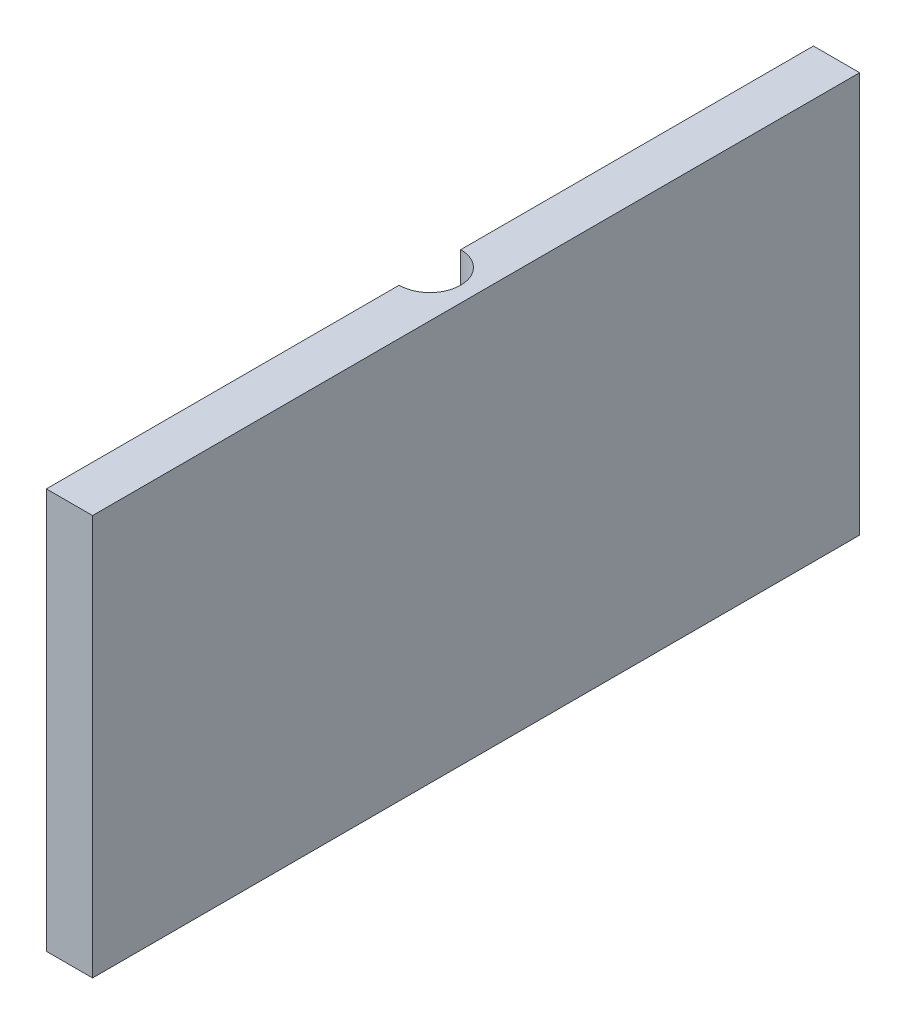
ISO-10303-21;
HEADER;
FILE_DESCRIPTION(('STEP AP214'),'2;1');
FILE_NAME('part.step','',(''),(''),'','','');
FILE_SCHEMA(('AUTOMOTIVE_DESIGN { 1 0 10303 214 1 1 1 1 }'));
ENDSEC;
DATA;
#1=APPLICATION_CONTEXT('core data for automotive mechanical design processes');
#2=APPLICATION_PROTOCOL_DEFINITION('international standard','automotive_design',2000,#1);
#3=PRODUCT_CONTEXT('',#1,'mechanical');
#4=PRODUCT('Part','Part','',(#3));
#5=PRODUCT_RELATED_PRODUCT_CATEGORY('part','',(#4));
#6=PRODUCT_DEFINITION_FORMATION('','',#4);
#7=PRODUCT_DEFINITION_CONTEXT('part definition',#1,'design');
#8=PRODUCT_DEFINITION('design','',#6,#7);
#9=PRODUCT_DEFINITION_SHAPE('','',#8);
#10=(LENGTH_UNIT() NAMED_UNIT(*) SI_UNIT(.MILLI.,.METRE.));
#11=(NAMED_UNIT(*) PLANE_ANGLE_UNIT() SI_UNIT($,.RADIAN.));
#12=(NAMED_UNIT(*) SI_UNIT($,.STERADIAN.) SOLID_ANGLE_UNIT());
#13=UNCERTAINTY_MEASURE_WITH_UNIT(LENGTH_MEASURE(1.E-05),#10,'distance_accuracy_value','');
#14=(GEOMETRIC_REPRESENTATION_CONTEXT(3) GLOBAL_UNCERTAINTY_ASSIGNED_CONTEXT((#13)) GLOBAL_UNIT_ASSIGNED_CONTEXT((#10,
#11,#12)) REPRESENTATION_CONTEXT('',''));
#15=CARTESIAN_POINT('',(0.,0.,0.));
#16=DIRECTION('',(0.,0.,1.));
#17=DIRECTION('',(1.,0.,0.));
#18=AXIS2_PLACEMENT_3D('',#15,#16,#17);
#19=CARTESIAN_POINT('',(7.5,130.,124.5));
#20=DIRECTION('',(-1.,0.,0.));
#21=DIRECTION('',(0.,0.,1.));
#22=AXIS2_PLACEMENT_3D('',#19,#20,#21);
#23=PLANE('',#22);
#24=DIRECTION('',(0.,0.,-1.));
#25=VECTOR('',#24,1.);
#26=CARTESIAN_POINT('',(7.5,0.,124.5));
#27=LINE('',#26,#25);
#28=CARTESIAN_POINT('',(7.5,0.,124.5));
#29=VERTEX_POINT('',#28);
#30=CARTESIAN_POINT('',(7.5,0.,-124.5));
#31=VERTEX_POINT('',#30);
#32=EDGE_CURVE('E118',#29,#31,#27,.T.);
#33=ORIENTED_EDGE('',*,*,#32,.T.);
#34=DIRECTION('',(0.,-1.,0.));
#35=VECTOR('',#34,1.);
#36=CARTESIAN_POINT('',(7.5,130.,-124.5));
#37=LINE('',#36,#35);
#38=CARTESIAN_POINT('',(7.5,130.,-124.5));
#39=VERTEX_POINT('',#38);
#40=EDGE_CURVE('E47',#39,#31,#37,.T.);
#41=ORIENTED_EDGE('',*,*,#40,.F.);
#42=DIRECTION('',(0.,0.,-1.));
#43=VECTOR('',#42,1.);
#44=CARTESIAN_POINT('',(7.5,130.,124.5));
#45=LINE('',#44,#43);
#46=CARTESIAN_POINT('',(7.5,130.,124.5));
#47=VERTEX_POINT('',#46);
#48=EDGE_CURVE('E122',#47,#39,#45,.T.);
#49=ORIENTED_EDGE('',*,*,#48,.F.);
#50=DIRECTION('',(0.,-1.,0.));
#51=VECTOR('',#50,1.);
#52=CARTESIAN_POINT('',(7.5,130.,124.5));
#53=LINE('',#52,#51);
#54=EDGE_CURVE('E133',#47,#29,#53,.T.);
#55=ORIENTED_EDGE('',*,*,#54,.T.);
#56=EDGE_LOOP('',(#33,#41,#49,#55));
#57=FACE_BOUND('',#56,.T.);
#58=ADVANCED_FACE('F39',(#57),#23,.F.);
#59=CARTESIAN_POINT('',(-7.5,130.,-124.5));
#60=DIRECTION('',(0.,0.,1.));
#61=DIRECTION('',(1.,0.,0.));
#62=AXIS2_PLACEMENT_3D('',#59,#60,#61);
#63=PLANE('',#62);
#64=DIRECTION('',(-1.,0.,0.));
#65=VECTOR('',#64,1.);
#66=CARTESIAN_POINT('',(-7.5,0.,-124.5));
#67=LINE('',#66,#65);
#68=CARTESIAN_POINT('',(-7.5,0.,-124.5));
#69=VERTEX_POINT('',#68);
#70=EDGE_CURVE('E137',#31,#69,#67,.T.);
#71=ORIENTED_EDGE('',*,*,#70,.T.);
#72=DIRECTION('',(0.,-1.,0.));
#73=VECTOR('',#72,1.);
#74=CARTESIAN_POINT('',(-7.5,130.,-124.5));
#75=LINE('',#74,#73);
#76=CARTESIAN_POINT('',(-7.5,130.,-124.5));
#77=VERTEX_POINT('',#76);
#78=EDGE_CURVE('E150',#77,#69,#75,.T.);
#79=ORIENTED_EDGE('',*,*,#78,.F.);
#80=DIRECTION('',(-1.,0.,0.));
#81=VECTOR('',#80,1.);
#82=CARTESIAN_POINT('',(-7.5,130.,-124.5));
#83=LINE('',#82,#81);
#84=EDGE_CURVE('E92',#39,#77,#83,.T.);
#85=ORIENTED_EDGE('',*,*,#84,.F.);
#86=ORIENTED_EDGE('',*,*,#40,.T.);
#87=EDGE_LOOP('',(#71,#79,#85,#86));
#88=FACE_BOUND('',#87,.T.);
#89=ADVANCED_FACE('F155',(#88),#63,.F.);
#90=CARTESIAN_POINT('',(-7.5,130.,124.5));
#91=DIRECTION('',(1.,0.,0.));
#92=DIRECTION('',(0.,0.,-1.));
#93=AXIS2_PLACEMENT_3D('',#90,#91,#92);
#94=PLANE('',#93);
#95=DIRECTION('',(0.,0.,1.));
#96=VECTOR('',#95,1.);
#97=CARTESIAN_POINT('',(-7.5,80.,124.5));
#98=LINE('',#97,#96);
#99=CARTESIAN_POINT('',(-7.5,80.,-9.99999999999969));
#100=VERTEX_POINT('',#99);
#101=CARTESIAN_POINT('',(-7.5,80.,10.0000000000003));
#102=VERTEX_POINT('',#101);
#103=EDGE_CURVE('E11',#100,#102,#98,.T.);
#104=ORIENTED_EDGE('',*,*,#103,.F.);
#105=DIRECTION('',(0.,1.,0.));
#106=VECTOR('',#105,1.);
#107=CARTESIAN_POINT('',(-7.5,80.,-9.99999999999969));
#108=LINE('',#107,#106);
#109=CARTESIAN_POINT('',(-7.5,130.,-9.99999999999969));
#110=VERTEX_POINT('',#109);
#111=EDGE_CURVE('E107',#100,#110,#108,.T.);
#112=ORIENTED_EDGE('',*,*,#111,.T.);
#113=DIRECTION('',(0.,0.,1.));
#114=VECTOR('',#113,1.);
#115=CARTESIAN_POINT('',(-7.5,130.,124.5));
#116=LINE('',#115,#114);
#117=EDGE_CURVE('E127',#77,#110,#116,.T.);
#118=ORIENTED_EDGE('',*,*,#117,.F.);
#119=ORIENTED_EDGE('',*,*,#78,.T.);
#120=DIRECTION('',(0.,0.,1.));
#121=VECTOR('',#120,1.);
#122=CARTESIAN_POINT('',(-7.5,0.,124.5));
#123=LINE('',#122,#121);
#124=CARTESIAN_POINT('',(-7.5,0.,124.5));
#125=VERTEX_POINT('',#124);
#126=EDGE_CURVE('E140',#69,#125,#123,.T.);
#127=ORIENTED_EDGE('',*,*,#126,.T.);
#128=DIRECTION('',(0.,-1.,0.));
#129=VECTOR('',#128,1.);
#130=CARTESIAN_POINT('',(-7.5,130.,124.5));
#131=LINE('',#130,#129);
#132=CARTESIAN_POINT('',(-7.5,130.,124.5));
#133=VERTEX_POINT('',#132);
#134=EDGE_CURVE('E147',#133,#125,#131,.T.);
#135=ORIENTED_EDGE('',*,*,#134,.F.);
#136=CARTESIAN_POINT('',(-7.5,130.,10.0000000000003));
#137=VERTEX_POINT('',#136);
#138=EDGE_CURVE('E114',#137,#133,#116,.T.);
#139=ORIENTED_EDGE('',*,*,#138,.F.);
#140=DIRECTION('',(0.,1.,0.));
#141=VECTOR('',#140,1.);
#142=CARTESIAN_POINT('',(-7.5,80.,10.0000000000003));
#143=LINE('',#142,#141);
#144=EDGE_CURVE('E54',#137,#102,#143,.F.);
#145=ORIENTED_EDGE('',*,*,#144,.T.);
#146=EDGE_LOOP('',(#104,#112,#118,#119,#127,#135,#139,#145));
#147=FACE_BOUND('',#146,.T.);
#148=ADVANCED_FACE('F112',(#147),#94,.F.);
#149=CARTESIAN_POINT('',(-7.5,130.,124.5));
#150=DIRECTION('',(0.,0.,-1.));
#151=DIRECTION('',(-1.,0.,0.));
#152=AXIS2_PLACEMENT_3D('',#149,#150,#151);
#153=PLANE('',#152);
#154=DIRECTION('',(1.,0.,0.));
#155=VECTOR('',#154,1.);
#156=CARTESIAN_POINT('',(-7.5,0.,124.5));
#157=LINE('',#156,#155);
#158=EDGE_CURVE('E84',#125,#29,#157,.T.);
#159=ORIENTED_EDGE('',*,*,#158,.T.);
#160=ORIENTED_EDGE('',*,*,#54,.F.);
#161=DIRECTION('',(1.,0.,0.));
#162=VECTOR('',#161,1.);
#163=CARTESIAN_POINT('',(-7.5,130.,124.5));
#164=LINE('',#163,#162);
#165=EDGE_CURVE('E63',#133,#47,#164,.T.);
#166=ORIENTED_EDGE('',*,*,#165,.F.);
#167=ORIENTED_EDGE('',*,*,#134,.T.);
#168=EDGE_LOOP('',(#159,#160,#166,#167));
#169=FACE_BOUND('',#168,.T.);
#170=ADVANCED_FACE('F163',(#169),#153,.F.);
#171=CARTESIAN_POINT('',(0.,130.,0.));
#172=DIRECTION('',(0.,-1.,0.));
#173=DIRECTION('',(0.,0.,-1.));
#174=AXIS2_PLACEMENT_3D('',#171,#172,#173);
#175=PLANE('',#174);
#176=ORIENTED_EDGE('',*,*,#117,.T.);
#177=CARTESIAN_POINT('',(-7.5,130.,3.05311331771918E-13));
#178=DIRECTION('',(0.,1.,0.));
#179=DIRECTION('',(0.,0.,1.));
#180=AXIS2_PLACEMENT_3D('',#177,#178,#179);
#181=CIRCLE('',#180,10.);
#182=EDGE_CURVE('E109',#137,#110,#181,.T.);
#183=ORIENTED_EDGE('',*,*,#182,.F.);
#184=ORIENTED_EDGE('',*,*,#138,.T.);
#185=ORIENTED_EDGE('',*,*,#165,.T.);
#186=ORIENTED_EDGE('',*,*,#48,.T.);
#187=ORIENTED_EDGE('',*,*,#84,.T.);
#188=EDGE_LOOP('',(#176,#183,#184,#185,#186,#187));
#189=FACE_BOUND('',#188,.T.);
#190=ADVANCED_FACE('F164',(#189),#175,.F.);
#191=CARTESIAN_POINT('',(0.,0.,0.));
#192=DIRECTION('',(0.,-1.,0.));
#193=DIRECTION('',(0.,0.,-1.));
#194=AXIS2_PLACEMENT_3D('',#191,#192,#193);
#195=PLANE('',#194);
#196=ORIENTED_EDGE('',*,*,#32,.F.);
#197=ORIENTED_EDGE('',*,*,#158,.F.);
#198=ORIENTED_EDGE('',*,*,#126,.F.);
#199=ORIENTED_EDGE('',*,*,#70,.F.);
#200=EDGE_LOOP('',(#196,#197,#198,#199));
#201=FACE_BOUND('',#200,.T.);
#202=ADVANCED_FACE('F160',(#201),#195,.T.);
#203=CARTESIAN_POINT('',(-7.5,80.,3.05311331771918E-13));
#204=DIRECTION('',(0.,1.,0.));
#205=DIRECTION('',(0.,0.,1.));
#206=AXIS2_PLACEMENT_3D('',#203,#204,#205);
#207=PLANE('',#206);
#208=ORIENTED_EDGE('',*,*,#103,.T.);
#209=CARTESIAN_POINT('',(-7.5,80.,3.05311331771918E-13));
#210=DIRECTION('',(0.,1.,0.));
#211=DIRECTION('',(0.,0.,1.));
#212=AXIS2_PLACEMENT_3D('',#209,#210,#211);
#213=CIRCLE('',#212,10.);
#214=EDGE_CURVE('E103',#102,#100,#213,.T.);
#215=ORIENTED_EDGE('',*,*,#214,.T.);
#216=EDGE_LOOP('',(#208,#215));
#217=FACE_BOUND('',#216,.T.);
#218=ADVANCED_FACE('F102',(#217),#207,.T.);
#219=CARTESIAN_POINT('',(-7.5,80.,3.05311331771918E-13));
#220=DIRECTION('',(0.,1.,0.));
#221=DIRECTION('',(0.,0.,1.));
#222=AXIS2_PLACEMENT_3D('',#219,#220,#221);
#223=CYLINDRICAL_SURFACE('',#222,10.);
#224=ORIENTED_EDGE('',*,*,#214,.F.);
#225=ORIENTED_EDGE('',*,*,#144,.F.);
#226=ORIENTED_EDGE('',*,*,#182,.T.);
#227=ORIENTED_EDGE('',*,*,#111,.F.);
#228=EDGE_LOOP('',(#224,#225,#226,#227));
#229=FACE_BOUND('',#228,.T.);
#230=ADVANCED_FACE('F106',(#229),#223,.F.);
#231=CLOSED_SHELL('',(#58,#89,#148,#170,#190,#202,#218,#230));
#232=MANIFOLD_SOLID_BREP('B2',#231);
#233=ADVANCED_BREP_SHAPE_REPRESENTATION('',(#18,#232),#14);
#234=SHAPE_DEFINITION_REPRESENTATION(#9,#233);
ENDSEC;
END-ISO-10303-21;
